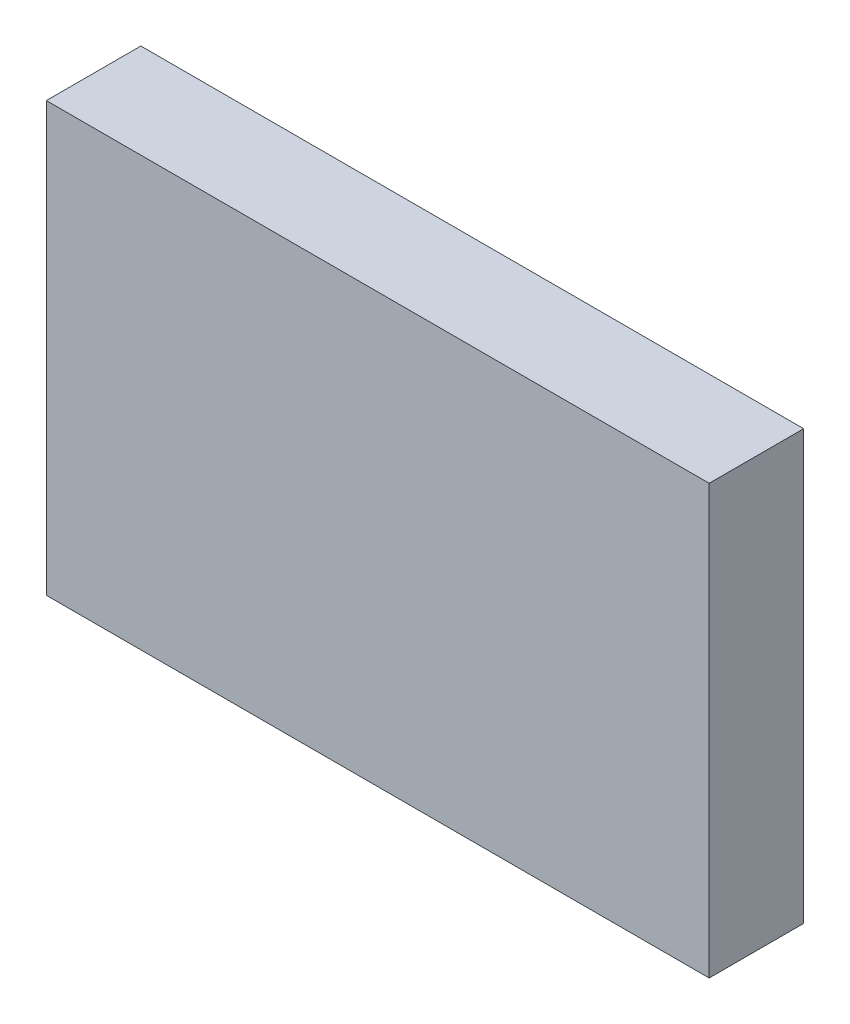
ISO-10303-21;
HEADER;
FILE_DESCRIPTION(('STEP AP214'),'2;1');
FILE_NAME('part.step','',(''),(''),'','','');
FILE_SCHEMA(('AUTOMOTIVE_DESIGN { 1 0 10303 214 1 1 1 1 }'));
ENDSEC;
DATA;
#1=APPLICATION_CONTEXT('core data for automotive mechanical design processes');
#2=APPLICATION_PROTOCOL_DEFINITION('international standard','automotive_design',2000,#1);
#3=PRODUCT_CONTEXT('',#1,'mechanical');
#4=PRODUCT('Part','Part','',(#3));
#5=PRODUCT_RELATED_PRODUCT_CATEGORY('part','',(#4));
#6=PRODUCT_DEFINITION_FORMATION('','',#4);
#7=PRODUCT_DEFINITION_CONTEXT('part definition',#1,'design');
#8=PRODUCT_DEFINITION('design','',#6,#7);
#9=PRODUCT_DEFINITION_SHAPE('','',#8);
#10=(LENGTH_UNIT() NAMED_UNIT(*) SI_UNIT(.MILLI.,.METRE.));
#11=(NAMED_UNIT(*) PLANE_ANGLE_UNIT() SI_UNIT($,.RADIAN.));
#12=(NAMED_UNIT(*) SI_UNIT($,.STERADIAN.) SOLID_ANGLE_UNIT());
#13=UNCERTAINTY_MEASURE_WITH_UNIT(LENGTH_MEASURE(1.E-05),#10,'distance_accuracy_value','');
#14=(GEOMETRIC_REPRESENTATION_CONTEXT(3) GLOBAL_UNCERTAINTY_ASSIGNED_CONTEXT((#13)) GLOBAL_UNIT_ASSIGNED_CONTEXT((#10,
#11,#12)) REPRESENTATION_CONTEXT('',''));
#15=CARTESIAN_POINT('',(0.,0.,0.));
#16=DIRECTION('',(0.,0.,1.));
#17=DIRECTION('',(1.,0.,0.));
#18=AXIS2_PLACEMENT_3D('',#15,#16,#17);
#19=CARTESIAN_POINT('',(-2.62999982,-1.69999914,0.75000104));
#20=DIRECTION('',(0.,0.,1.));
#21=DIRECTION('',(1.,0.,0.));
#22=AXIS2_PLACEMENT_3D('',#19,#20,#21);
#23=PLANE('',#22);
#24=DIRECTION('',(-1.,0.,0.));
#25=VECTOR('',#24,1.);
#26=CARTESIAN_POINT('',(2.62999982,-1.69999914,0.75000104));
#27=LINE('',#26,#25);
#28=CARTESIAN_POINT('',(2.62999982,-1.69999914,0.75000104));
#29=VERTEX_POINT('',#28);
#30=CARTESIAN_POINT('',(-2.62999982,-1.69999914,0.75000104));
#31=VERTEX_POINT('',#30);
#32=EDGE_CURVE('E27',#29,#31,#27,.T.);
#33=ORIENTED_EDGE('',*,*,#32,.F.);
#34=DIRECTION('',(0.,-1.,0.));
#35=VECTOR('',#34,1.);
#36=CARTESIAN_POINT('',(2.62999982,1.69999914,0.75000104));
#37=LINE('',#36,#35);
#38=CARTESIAN_POINT('',(2.62999982,1.69999914,0.75000104));
#39=VERTEX_POINT('',#38);
#40=EDGE_CURVE('E71',#39,#29,#37,.T.);
#41=ORIENTED_EDGE('',*,*,#40,.F.);
#42=DIRECTION('',(1.,0.,0.));
#43=VECTOR('',#42,1.);
#44=CARTESIAN_POINT('',(-2.62999982,1.69999914,0.75000104));
#45=LINE('',#44,#43);
#46=CARTESIAN_POINT('',(-2.62999982,1.69999914,0.75000104));
#47=VERTEX_POINT('',#46);
#48=EDGE_CURVE('E91',#47,#39,#45,.T.);
#49=ORIENTED_EDGE('',*,*,#48,.F.);
#50=DIRECTION('',(0.,1.,0.));
#51=VECTOR('',#50,1.);
#52=CARTESIAN_POINT('',(-2.62999982,-1.69999914,0.75000104));
#53=LINE('',#52,#51);
#54=EDGE_CURVE('E93',#31,#47,#53,.T.);
#55=ORIENTED_EDGE('',*,*,#54,.F.);
#56=EDGE_LOOP('',(#33,#41,#49,#55));
#57=FACE_BOUND('',#56,.T.);
#58=ADVANCED_FACE('F16',(#57),#23,.T.);
#59=CARTESIAN_POINT('',(-2.62999982,-1.69999914,0.));
#60=DIRECTION('',(0.,0.,1.));
#61=DIRECTION('',(1.,0.,0.));
#62=AXIS2_PLACEMENT_3D('',#59,#60,#61);
#63=PLANE('',#62);
#64=DIRECTION('',(0.,1.,0.));
#65=VECTOR('',#64,1.);
#66=CARTESIAN_POINT('',(-2.62999982,-1.69999914,0.));
#67=LINE('',#66,#65);
#68=CARTESIAN_POINT('',(-2.62999982,-1.69999914,0.));
#69=VERTEX_POINT('',#68);
#70=CARTESIAN_POINT('',(-2.62999982,1.69999914,0.));
#71=VERTEX_POINT('',#70);
#72=EDGE_CURVE('E20',#69,#71,#67,.T.);
#73=ORIENTED_EDGE('',*,*,#72,.T.);
#74=DIRECTION('',(1.,0.,0.));
#75=VECTOR('',#74,1.);
#76=CARTESIAN_POINT('',(-2.62999982,1.69999914,0.));
#77=LINE('',#76,#75);
#78=CARTESIAN_POINT('',(2.62999982,1.69999914,0.));
#79=VERTEX_POINT('',#78);
#80=EDGE_CURVE('E79',#71,#79,#77,.T.);
#81=ORIENTED_EDGE('',*,*,#80,.T.);
#82=DIRECTION('',(0.,-1.,0.));
#83=VECTOR('',#82,1.);
#84=CARTESIAN_POINT('',(2.62999982,1.69999914,0.));
#85=LINE('',#84,#83);
#86=CARTESIAN_POINT('',(2.62999982,-1.69999914,0.));
#87=VERTEX_POINT('',#86);
#88=EDGE_CURVE('E164',#79,#87,#85,.T.);
#89=ORIENTED_EDGE('',*,*,#88,.T.);
#90=DIRECTION('',(-1.,0.,0.));
#91=VECTOR('',#90,1.);
#92=CARTESIAN_POINT('',(2.62999982,-1.69999914,0.));
#93=LINE('',#92,#91);
#94=EDGE_CURVE('E11',#87,#69,#93,.T.);
#95=ORIENTED_EDGE('',*,*,#94,.T.);
#96=EDGE_LOOP('',(#73,#81,#89,#95));
#97=FACE_BOUND('',#96,.T.);
#98=ADVANCED_FACE('F18',(#97),#63,.F.);
#99=CARTESIAN_POINT('',(2.62999982,-1.69999914,0.));
#100=DIRECTION('',(0.,-1.,0.));
#101=DIRECTION('',(0.,0.,-1.));
#102=AXIS2_PLACEMENT_3D('',#99,#100,#101);
#103=PLANE('',#102);
#104=DIRECTION('',(0.,0.,1.));
#105=VECTOR('',#104,1.);
#106=CARTESIAN_POINT('',(2.62999982,-1.69999914,0.));
#107=LINE('',#106,#105);
#108=EDGE_CURVE('E108',#87,#29,#107,.T.);
#109=ORIENTED_EDGE('',*,*,#108,.T.);
#110=ORIENTED_EDGE('',*,*,#32,.T.);
#111=DIRECTION('',(0.,0.,1.));
#112=VECTOR('',#111,1.);
#113=CARTESIAN_POINT('',(-2.62999982,-1.69999914,0.));
#114=LINE('',#113,#112);
#115=EDGE_CURVE('E100',#69,#31,#114,.T.);
#116=ORIENTED_EDGE('',*,*,#115,.F.);
#117=ORIENTED_EDGE('',*,*,#94,.F.);
#118=EDGE_LOOP('',(#109,#110,#116,#117));
#119=FACE_BOUND('',#118,.T.);
#120=ADVANCED_FACE('F112',(#119),#103,.T.);
#121=CARTESIAN_POINT('',(2.62999982,1.69999914,0.));
#122=DIRECTION('',(1.,0.,0.));
#123=DIRECTION('',(0.,1.,0.));
#124=AXIS2_PLACEMENT_3D('',#121,#122,#123);
#125=PLANE('',#124);
#126=DIRECTION('',(0.,0.,1.));
#127=VECTOR('',#126,1.);
#128=CARTESIAN_POINT('',(2.62999982,1.69999914,0.));
#129=LINE('',#128,#127);
#130=EDGE_CURVE('E85',#79,#39,#129,.T.);
#131=ORIENTED_EDGE('',*,*,#130,.T.);
#132=ORIENTED_EDGE('',*,*,#40,.T.);
#133=ORIENTED_EDGE('',*,*,#108,.F.);
#134=ORIENTED_EDGE('',*,*,#88,.F.);
#135=EDGE_LOOP('',(#131,#132,#133,#134));
#136=FACE_BOUND('',#135,.T.);
#137=ADVANCED_FACE('F115',(#136),#125,.T.);
#138=CARTESIAN_POINT('',(-2.62999982,1.69999914,0.));
#139=DIRECTION('',(0.,1.,0.));
#140=DIRECTION('',(1.,0.,0.));
#141=AXIS2_PLACEMENT_3D('',#138,#139,#140);
#142=PLANE('',#141);
#143=DIRECTION('',(0.,0.,1.));
#144=VECTOR('',#143,1.);
#145=CARTESIAN_POINT('',(-2.62999982,1.69999914,0.));
#146=LINE('',#145,#144);
#147=EDGE_CURVE('E83',#71,#47,#146,.T.);
#148=ORIENTED_EDGE('',*,*,#147,.T.);
#149=ORIENTED_EDGE('',*,*,#48,.T.);
#150=ORIENTED_EDGE('',*,*,#130,.F.);
#151=ORIENTED_EDGE('',*,*,#80,.F.);
#152=EDGE_LOOP('',(#148,#149,#150,#151));
#153=FACE_BOUND('',#152,.T.);
#154=ADVANCED_FACE('F80',(#153),#142,.T.);
#155=CARTESIAN_POINT('',(-2.62999982,-1.69999914,0.));
#156=DIRECTION('',(-1.,0.,0.));
#157=DIRECTION('',(0.,0.,1.));
#158=AXIS2_PLACEMENT_3D('',#155,#156,#157);
#159=PLANE('',#158);
#160=ORIENTED_EDGE('',*,*,#115,.T.);
#161=ORIENTED_EDGE('',*,*,#54,.T.);
#162=ORIENTED_EDGE('',*,*,#147,.F.);
#163=ORIENTED_EDGE('',*,*,#72,.F.);
#164=EDGE_LOOP('',(#160,#161,#162,#163));
#165=FACE_BOUND('',#164,.T.);
#166=ADVANCED_FACE('F92',(#165),#159,.T.);
#167=CLOSED_SHELL('',(#58,#98,#120,#137,#154,#166));
#168=MANIFOLD_SOLID_BREP('B1',#167);
#169=ADVANCED_BREP_SHAPE_REPRESENTATION('',(#18,#168),#14);
#170=SHAPE_DEFINITION_REPRESENTATION(#9,#169);
ENDSEC;
END-ISO-10303-21;
